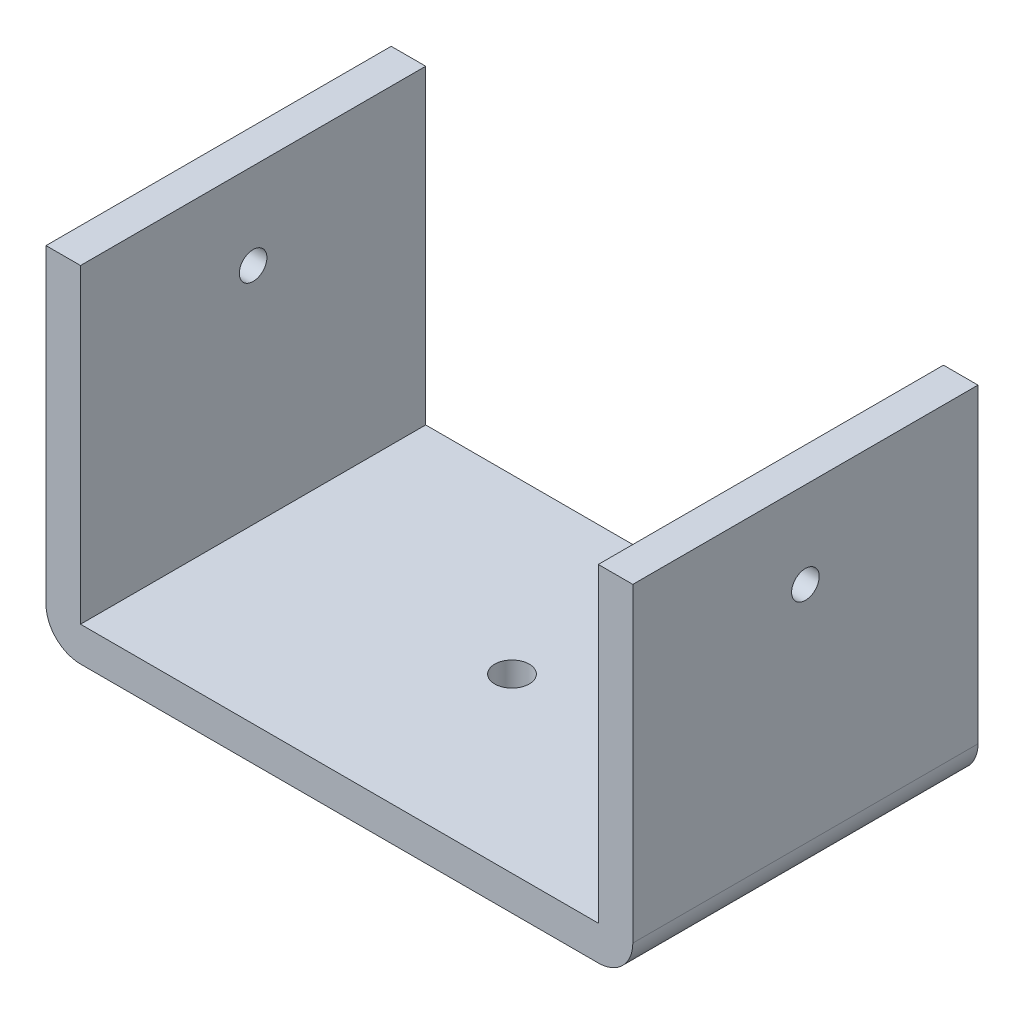
ISO-10303-21;
HEADER;
FILE_DESCRIPTION(('STEP AP214'),'2;1');
FILE_NAME('part.step','',(''),(''),'','','');
FILE_SCHEMA(('AUTOMOTIVE_DESIGN { 1 0 10303 214 1 1 1 1 }'));
ENDSEC;
DATA;
#1=APPLICATION_CONTEXT('core data for automotive mechanical design processes');
#2=APPLICATION_PROTOCOL_DEFINITION('international standard','automotive_design',2000,#1);
#3=PRODUCT_CONTEXT('',#1,'mechanical');
#4=PRODUCT('Part','Part','',(#3));
#5=PRODUCT_RELATED_PRODUCT_CATEGORY('part','',(#4));
#6=PRODUCT_DEFINITION_FORMATION('','',#4);
#7=PRODUCT_DEFINITION_CONTEXT('part definition',#1,'design');
#8=PRODUCT_DEFINITION('design','',#6,#7);
#9=PRODUCT_DEFINITION_SHAPE('','',#8);
#10=(LENGTH_UNIT() NAMED_UNIT(*) SI_UNIT(.MILLI.,.METRE.));
#11=(NAMED_UNIT(*) PLANE_ANGLE_UNIT() SI_UNIT($,.RADIAN.));
#12=(NAMED_UNIT(*) SI_UNIT($,.STERADIAN.) SOLID_ANGLE_UNIT());
#13=UNCERTAINTY_MEASURE_WITH_UNIT(LENGTH_MEASURE(1.E-05),#10,'distance_accuracy_value','');
#14=(GEOMETRIC_REPRESENTATION_CONTEXT(3) GLOBAL_UNCERTAINTY_ASSIGNED_CONTEXT((#13)) GLOBAL_UNIT_ASSIGNED_CONTEXT((#10,
#11,#12)) REPRESENTATION_CONTEXT('',''));
#15=CARTESIAN_POINT('',(0.,0.,0.));
#16=DIRECTION('',(0.,0.,1.));
#17=DIRECTION('',(1.,0.,0.));
#18=AXIS2_PLACEMENT_3D('',#15,#16,#17);
#19=CARTESIAN_POINT('',(0.,0.,100.));
#20=DIRECTION('',(0.,1.,0.));
#21=DIRECTION('',(0.,0.,1.));
#22=AXIS2_PLACEMENT_3D('',#19,#20,#21);
#23=PLANE('',#22);
#24=CARTESIAN_POINT('',(75.,0.,50.));
#25=DIRECTION('',(0.,1.,0.));
#26=DIRECTION('',(0.,0.,1.));
#27=AXIS2_PLACEMENT_3D('',#24,#25,#26);
#28=CIRCLE('',#27,5.00000000000001);
#29=CARTESIAN_POINT('',(75.,0.,55.));
#30=VERTEX_POINT('',#29);
#31=EDGE_CURVE('E339',#30,#30,#28,.T.);
#32=ORIENTED_EDGE('',*,*,#31,.F.);
#33=EDGE_LOOP('',(#32));
#34=FACE_BOUND('',#33,.T.);
#35=DIRECTION('',(1.,0.,0.));
#36=VECTOR('',#35,1.);
#37=CARTESIAN_POINT('',(0.,0.,0.));
#38=LINE('',#37,#36);
#39=CARTESIAN_POINT('',(0.,0.,0.));
#40=VERTEX_POINT('',#39);
#41=CARTESIAN_POINT('',(150.,0.,0.));
#42=VERTEX_POINT('',#41);
#43=EDGE_CURVE('E123',#40,#42,#38,.T.);
#44=ORIENTED_EDGE('',*,*,#43,.F.);
#45=DIRECTION('',(0.,0.,-1.));
#46=VECTOR('',#45,1.);
#47=CARTESIAN_POINT('',(0.,0.,100.));
#48=LINE('',#47,#46);
#49=CARTESIAN_POINT('',(0.,0.,100.));
#50=VERTEX_POINT('',#49);
#51=EDGE_CURVE('E118',#50,#40,#48,.T.);
#52=ORIENTED_EDGE('',*,*,#51,.F.);
#53=DIRECTION('',(1.,0.,0.));
#54=VECTOR('',#53,1.);
#55=CARTESIAN_POINT('',(0.,0.,100.));
#56=LINE('',#55,#54);
#57=CARTESIAN_POINT('',(150.,0.,100.));
#58=VERTEX_POINT('',#57);
#59=EDGE_CURVE('E120',#50,#58,#56,.T.);
#60=ORIENTED_EDGE('',*,*,#59,.T.);
#61=DIRECTION('',(0.,0.,-1.));
#62=VECTOR('',#61,1.);
#63=CARTESIAN_POINT('',(150.,0.,100.));
#64=LINE('',#63,#62);
#65=EDGE_CURVE('E158',#58,#42,#64,.T.);
#66=ORIENTED_EDGE('',*,*,#65,.T.);
#67=EDGE_LOOP('',(#44,#52,#60,#66));
#68=FACE_BOUND('',#67,.T.);
#69=ADVANCED_FACE('F39',(#34,#68),#23,.T.);
#70=CARTESIAN_POINT('',(0.,0.,100.));
#71=DIRECTION('',(1.,0.,0.));
#72=DIRECTION('',(0.,0.,-1.));
#73=AXIS2_PLACEMENT_3D('',#70,#71,#72);
#74=PLANE('',#73);
#75=CARTESIAN_POINT('',(0.,65.,50.));
#76=DIRECTION('',(1.,0.,0.));
#77=DIRECTION('',(0.,0.,-1.));
#78=AXIS2_PLACEMENT_3D('',#75,#76,#77);
#79=CIRCLE('',#78,4.00000000000001);
#80=CARTESIAN_POINT('',(0.,65.,46.));
#81=VERTEX_POINT('',#80);
#82=EDGE_CURVE('E328',#81,#81,#79,.T.);
#83=ORIENTED_EDGE('',*,*,#82,.F.);
#84=EDGE_LOOP('',(#83));
#85=FACE_BOUND('',#84,.T.);
#86=DIRECTION('',(0.,-1.,0.));
#87=VECTOR('',#86,1.);
#88=CARTESIAN_POINT('',(0.,0.,0.));
#89=LINE('',#88,#87);
#90=CARTESIAN_POINT('',(0.,90.,0.));
#91=VERTEX_POINT('',#90);
#92=EDGE_CURVE('E160',#91,#40,#89,.T.);
#93=ORIENTED_EDGE('',*,*,#92,.F.);
#94=DIRECTION('',(0.,0.,-1.));
#95=VECTOR('',#94,1.);
#96=CARTESIAN_POINT('',(0.,90.,100.));
#97=LINE('',#96,#95);
#98=CARTESIAN_POINT('',(0.,90.,100.));
#99=VERTEX_POINT('',#98);
#100=EDGE_CURVE('E129',#99,#91,#97,.T.);
#101=ORIENTED_EDGE('',*,*,#100,.F.);
#102=DIRECTION('',(0.,-1.,0.));
#103=VECTOR('',#102,1.);
#104=CARTESIAN_POINT('',(0.,0.,100.));
#105=LINE('',#104,#103);
#106=EDGE_CURVE('E135',#99,#50,#105,.T.);
#107=ORIENTED_EDGE('',*,*,#106,.T.);
#108=ORIENTED_EDGE('',*,*,#51,.T.);
#109=EDGE_LOOP('',(#93,#101,#107,#108));
#110=FACE_BOUND('',#109,.T.);
#111=ADVANCED_FACE('F141',(#85,#110),#74,.T.);
#112=CARTESIAN_POINT('',(0.,90.,100.));
#113=DIRECTION('',(0.,-1.,0.));
#114=DIRECTION('',(0.,0.,-1.));
#115=AXIS2_PLACEMENT_3D('',#112,#113,#114);
#116=PLANE('',#115);
#117=DIRECTION('',(-1.,0.,0.));
#118=VECTOR('',#117,1.);
#119=CARTESIAN_POINT('',(0.,90.,0.));
#120=LINE('',#119,#118);
#121=CARTESIAN_POINT('',(-10.,90.,0.));
#122=VERTEX_POINT('',#121);
#123=EDGE_CURVE('E163',#91,#122,#120,.T.);
#124=ORIENTED_EDGE('',*,*,#123,.T.);
#125=DIRECTION('',(0.,0.,-1.));
#126=VECTOR('',#125,1.);
#127=CARTESIAN_POINT('',(-10.,90.,100.));
#128=LINE('',#127,#126);
#129=CARTESIAN_POINT('',(-10.,90.,100.));
#130=VERTEX_POINT('',#129);
#131=EDGE_CURVE('E183',#130,#122,#128,.T.);
#132=ORIENTED_EDGE('',*,*,#131,.F.);
#133=DIRECTION('',(-1.,0.,0.));
#134=VECTOR('',#133,1.);
#135=CARTESIAN_POINT('',(0.,90.,100.));
#136=LINE('',#135,#134);
#137=EDGE_CURVE('E143',#99,#130,#136,.T.);
#138=ORIENTED_EDGE('',*,*,#137,.F.);
#139=ORIENTED_EDGE('',*,*,#100,.T.);
#140=EDGE_LOOP('',(#124,#132,#138,#139));
#141=FACE_BOUND('',#140,.T.);
#142=ADVANCED_FACE('F219',(#141),#116,.F.);
#143=CARTESIAN_POINT('',(-10.,0.,100.));
#144=DIRECTION('',(-1.,0.,0.));
#145=DIRECTION('',(0.,-1.,0.));
#146=AXIS2_PLACEMENT_3D('',#143,#144,#145);
#147=PLANE('',#146);
#148=CARTESIAN_POINT('',(-10.,65.,50.));
#149=DIRECTION('',(-1.,0.,0.));
#150=DIRECTION('',(0.,-1.,0.));
#151=AXIS2_PLACEMENT_3D('',#148,#149,#150);
#152=CIRCLE('',#151,4.00000000000001);
#153=CARTESIAN_POINT('',(-10.,61.,50.));
#154=VERTEX_POINT('',#153);
#155=EDGE_CURVE('E331',#154,#154,#152,.T.);
#156=ORIENTED_EDGE('',*,*,#155,.F.);
#157=EDGE_LOOP('',(#156));
#158=FACE_BOUND('',#157,.T.);
#159=DIRECTION('',(0.,1.,0.));
#160=VECTOR('',#159,1.);
#161=CARTESIAN_POINT('',(-10.,0.,0.));
#162=LINE('',#161,#160);
#163=CARTESIAN_POINT('',(-10.,0.,0.));
#164=VERTEX_POINT('',#163);
#165=EDGE_CURVE('E166',#164,#122,#162,.T.);
#166=ORIENTED_EDGE('',*,*,#165,.F.);
#167=DIRECTION('',(0.,0.,-1.));
#168=VECTOR('',#167,1.);
#169=CARTESIAN_POINT('',(-10.,0.,100.));
#170=LINE('',#169,#168);
#171=CARTESIAN_POINT('',(-10.,0.,100.));
#172=VERTEX_POINT('',#171);
#173=EDGE_CURVE('E11',#164,#172,#170,.F.);
#174=ORIENTED_EDGE('',*,*,#173,.T.);
#175=DIRECTION('',(0.,1.,0.));
#176=VECTOR('',#175,1.);
#177=CARTESIAN_POINT('',(-10.,0.,100.));
#178=LINE('',#177,#176);
#179=EDGE_CURVE('E145',#172,#130,#178,.T.);
#180=ORIENTED_EDGE('',*,*,#179,.T.);
#181=ORIENTED_EDGE('',*,*,#131,.T.);
#182=EDGE_LOOP('',(#166,#174,#180,#181));
#183=FACE_BOUND('',#182,.T.);
#184=ADVANCED_FACE('F216',(#158,#183),#147,.T.);
#185=CARTESIAN_POINT('',(0.,-10.,100.));
#186=DIRECTION('',(0.,1.,0.));
#187=DIRECTION('',(0.,0.,1.));
#188=AXIS2_PLACEMENT_3D('',#185,#186,#187);
#189=PLANE('',#188);
#190=CARTESIAN_POINT('',(75.,-10.,50.));
#191=DIRECTION('',(0.,1.,0.));
#192=DIRECTION('',(0.,0.,1.));
#193=AXIS2_PLACEMENT_3D('',#190,#191,#192);
#194=CIRCLE('',#193,5.00000000000001);
#195=CARTESIAN_POINT('',(75.,-10.,55.));
#196=VERTEX_POINT('',#195);
#197=EDGE_CURVE('E161',#196,#196,#194,.T.);
#198=ORIENTED_EDGE('',*,*,#197,.T.);
#199=EDGE_LOOP('',(#198));
#200=FACE_BOUND('',#199,.T.);
#201=DIRECTION('',(1.,0.,0.));
#202=VECTOR('',#201,1.);
#203=CARTESIAN_POINT('',(0.,-10.,0.));
#204=LINE('',#203,#202);
#205=CARTESIAN_POINT('',(0.,-10.,0.));
#206=VERTEX_POINT('',#205);
#207=CARTESIAN_POINT('',(150.,-10.,0.));
#208=VERTEX_POINT('',#207);
#209=EDGE_CURVE('E168',#206,#208,#204,.T.);
#210=ORIENTED_EDGE('',*,*,#209,.T.);
#211=DIRECTION('',(0.,0.,-1.));
#212=VECTOR('',#211,1.);
#213=CARTESIAN_POINT('',(150.,-10.,100.));
#214=LINE('',#213,#212);
#215=CARTESIAN_POINT('',(150.,-10.,100.));
#216=VERTEX_POINT('',#215);
#217=EDGE_CURVE('E61',#208,#216,#214,.F.);
#218=ORIENTED_EDGE('',*,*,#217,.T.);
#219=DIRECTION('',(1.,0.,0.));
#220=VECTOR('',#219,1.);
#221=CARTESIAN_POINT('',(0.,-10.,100.));
#222=LINE('',#221,#220);
#223=CARTESIAN_POINT('',(0.,-10.,100.));
#224=VERTEX_POINT('',#223);
#225=EDGE_CURVE('E150',#224,#216,#222,.T.);
#226=ORIENTED_EDGE('',*,*,#225,.F.);
#227=DIRECTION('',(0.,0.,-1.));
#228=VECTOR('',#227,1.);
#229=CARTESIAN_POINT('',(0.,-10.,0.));
#230=LINE('',#229,#228);
#231=EDGE_CURVE('E193',#224,#206,#230,.T.);
#232=ORIENTED_EDGE('',*,*,#231,.T.);
#233=EDGE_LOOP('',(#210,#218,#226,#232));
#234=FACE_BOUND('',#233,.T.);
#235=ADVANCED_FACE('F211',(#200,#234),#189,.F.);
#236=CARTESIAN_POINT('',(160.,0.,100.));
#237=DIRECTION('',(-1.,0.,0.));
#238=DIRECTION('',(0.,0.,1.));
#239=AXIS2_PLACEMENT_3D('',#236,#237,#238);
#240=PLANE('',#239);
#241=CARTESIAN_POINT('',(160.,65.,50.));
#242=DIRECTION('',(-1.,0.,0.));
#243=DIRECTION('',(0.,0.,1.));
#244=AXIS2_PLACEMENT_3D('',#241,#242,#243);
#245=CIRCLE('',#244,4.00000000000001);
#246=CARTESIAN_POINT('',(160.,65.,54.));
#247=VERTEX_POINT('',#246);
#248=EDGE_CURVE('E334',#247,#247,#245,.T.);
#249=ORIENTED_EDGE('',*,*,#248,.T.);
#250=EDGE_LOOP('',(#249));
#251=FACE_BOUND('',#250,.T.);
#252=DIRECTION('',(0.,1.,0.));
#253=VECTOR('',#252,1.);
#254=CARTESIAN_POINT('',(160.,0.,100.));
#255=LINE('',#254,#253);
#256=CARTESIAN_POINT('',(160.,0.,100.));
#257=VERTEX_POINT('',#256);
#258=CARTESIAN_POINT('',(160.,90.,100.));
#259=VERTEX_POINT('',#258);
#260=EDGE_CURVE('E152',#257,#259,#255,.T.);
#261=ORIENTED_EDGE('',*,*,#260,.F.);
#262=DIRECTION('',(0.,0.,-1.));
#263=VECTOR('',#262,1.);
#264=CARTESIAN_POINT('',(160.,0.,100.));
#265=LINE('',#264,#263);
#266=CARTESIAN_POINT('',(160.,0.,0.));
#267=VERTEX_POINT('',#266);
#268=EDGE_CURVE('E128',#257,#267,#265,.T.);
#269=ORIENTED_EDGE('',*,*,#268,.T.);
#270=DIRECTION('',(0.,1.,0.));
#271=VECTOR('',#270,1.);
#272=CARTESIAN_POINT('',(160.,0.,0.));
#273=LINE('',#272,#271);
#274=CARTESIAN_POINT('',(160.,90.,0.));
#275=VERTEX_POINT('',#274);
#276=EDGE_CURVE('E170',#267,#275,#273,.T.);
#277=ORIENTED_EDGE('',*,*,#276,.T.);
#278=DIRECTION('',(0.,0.,-1.));
#279=VECTOR('',#278,1.);
#280=CARTESIAN_POINT('',(160.,90.,100.));
#281=LINE('',#280,#279);
#282=EDGE_CURVE('E180',#259,#275,#281,.T.);
#283=ORIENTED_EDGE('',*,*,#282,.F.);
#284=EDGE_LOOP('',(#261,#269,#277,#283));
#285=FACE_BOUND('',#284,.T.);
#286=ADVANCED_FACE('F205',(#251,#285),#240,.F.);
#287=CARTESIAN_POINT('',(0.,90.,100.));
#288=DIRECTION('',(0.,1.,0.));
#289=DIRECTION('',(0.,0.,1.));
#290=AXIS2_PLACEMENT_3D('',#287,#288,#289);
#291=PLANE('',#290);
#292=DIRECTION('',(1.,0.,0.));
#293=VECTOR('',#292,1.);
#294=CARTESIAN_POINT('',(0.,90.,0.));
#295=LINE('',#294,#293);
#296=CARTESIAN_POINT('',(150.,90.,0.));
#297=VERTEX_POINT('',#296);
#298=EDGE_CURVE('E172',#297,#275,#295,.T.);
#299=ORIENTED_EDGE('',*,*,#298,.F.);
#300=DIRECTION('',(0.,0.,-1.));
#301=VECTOR('',#300,1.);
#302=CARTESIAN_POINT('',(150.,90.,100.));
#303=LINE('',#302,#301);
#304=CARTESIAN_POINT('',(150.,90.,100.));
#305=VERTEX_POINT('',#304);
#306=EDGE_CURVE('E178',#305,#297,#303,.T.);
#307=ORIENTED_EDGE('',*,*,#306,.F.);
#308=DIRECTION('',(1.,0.,0.));
#309=VECTOR('',#308,1.);
#310=CARTESIAN_POINT('',(0.,90.,100.));
#311=LINE('',#310,#309);
#312=EDGE_CURVE('E154',#305,#259,#311,.T.);
#313=ORIENTED_EDGE('',*,*,#312,.T.);
#314=ORIENTED_EDGE('',*,*,#282,.T.);
#315=EDGE_LOOP('',(#299,#307,#313,#314));
#316=FACE_BOUND('',#315,.T.);
#317=ADVANCED_FACE('F225',(#316),#291,.T.);
#318=CARTESIAN_POINT('',(150.,0.,100.));
#319=DIRECTION('',(-1.,0.,0.));
#320=DIRECTION('',(0.,0.,1.));
#321=AXIS2_PLACEMENT_3D('',#318,#319,#320);
#322=PLANE('',#321);
#323=CARTESIAN_POINT('',(150.,65.,50.));
#324=DIRECTION('',(-1.,0.,0.));
#325=DIRECTION('',(0.,0.,1.));
#326=AXIS2_PLACEMENT_3D('',#323,#324,#325);
#327=CIRCLE('',#326,4.00000000000001);
#328=CARTESIAN_POINT('',(150.,65.,54.));
#329=VERTEX_POINT('',#328);
#330=EDGE_CURVE('E43',#329,#329,#327,.T.);
#331=ORIENTED_EDGE('',*,*,#330,.F.);
#332=EDGE_LOOP('',(#331));
#333=FACE_BOUND('',#332,.T.);
#334=DIRECTION('',(0.,1.,0.));
#335=VECTOR('',#334,1.);
#336=CARTESIAN_POINT('',(150.,0.,0.));
#337=LINE('',#336,#335);
#338=EDGE_CURVE('E139',#42,#297,#337,.T.);
#339=ORIENTED_EDGE('',*,*,#338,.F.);
#340=ORIENTED_EDGE('',*,*,#65,.F.);
#341=DIRECTION('',(0.,1.,0.));
#342=VECTOR('',#341,1.);
#343=CARTESIAN_POINT('',(150.,0.,100.));
#344=LINE('',#343,#342);
#345=EDGE_CURVE('E138',#58,#305,#344,.T.);
#346=ORIENTED_EDGE('',*,*,#345,.T.);
#347=ORIENTED_EDGE('',*,*,#306,.T.);
#348=EDGE_LOOP('',(#339,#340,#346,#347));
#349=FACE_BOUND('',#348,.T.);
#350=ADVANCED_FACE('F222',(#333,#349),#322,.T.);
#351=CARTESIAN_POINT('',(0.,0.,100.));
#352=DIRECTION('',(0.,0.,1.));
#353=DIRECTION('',(1.,0.,0.));
#354=AXIS2_PLACEMENT_3D('',#351,#352,#353);
#355=PLANE('',#354);
#356=ORIENTED_EDGE('',*,*,#225,.T.);
#357=CARTESIAN_POINT('',(150.,0.,100.));
#358=DIRECTION('',(0.,0.,1.));
#359=DIRECTION('',(1.,0.,0.));
#360=AXIS2_PLACEMENT_3D('',#357,#358,#359);
#361=CIRCLE('',#360,10.);
#362=EDGE_CURVE('E48',#216,#257,#361,.T.);
#363=ORIENTED_EDGE('',*,*,#362,.T.);
#364=ORIENTED_EDGE('',*,*,#260,.T.);
#365=ORIENTED_EDGE('',*,*,#312,.F.);
#366=ORIENTED_EDGE('',*,*,#345,.F.);
#367=ORIENTED_EDGE('',*,*,#59,.F.);
#368=ORIENTED_EDGE('',*,*,#106,.F.);
#369=ORIENTED_EDGE('',*,*,#137,.T.);
#370=ORIENTED_EDGE('',*,*,#179,.F.);
#371=CARTESIAN_POINT('',(0.,0.,100.));
#372=DIRECTION('',(0.,0.,1.));
#373=DIRECTION('',(1.,0.,0.));
#374=AXIS2_PLACEMENT_3D('',#371,#372,#373);
#375=CIRCLE('',#374,10.);
#376=EDGE_CURVE('E197',#172,#224,#375,.T.);
#377=ORIENTED_EDGE('',*,*,#376,.T.);
#378=EDGE_LOOP('',(#356,#363,#364,#365,#366,#367,#368,#369,#370,#377));
#379=FACE_BOUND('',#378,.T.);
#380=ADVANCED_FACE('F133',(#379),#355,.T.);
#381=CARTESIAN_POINT('',(0.,0.,0.));
#382=DIRECTION('',(0.,0.,1.));
#383=DIRECTION('',(1.,0.,0.));
#384=AXIS2_PLACEMENT_3D('',#381,#382,#383);
#385=PLANE('',#384);
#386=ORIENTED_EDGE('',*,*,#276,.F.);
#387=CARTESIAN_POINT('',(150.,0.,0.));
#388=DIRECTION('',(0.,0.,1.));
#389=DIRECTION('',(1.,0.,0.));
#390=AXIS2_PLACEMENT_3D('',#387,#388,#389);
#391=CIRCLE('',#390,10.);
#392=EDGE_CURVE('E191',#267,#208,#391,.F.);
#393=ORIENTED_EDGE('',*,*,#392,.T.);
#394=ORIENTED_EDGE('',*,*,#209,.F.);
#395=CARTESIAN_POINT('',(0.,0.,0.));
#396=DIRECTION('',(0.,0.,1.));
#397=DIRECTION('',(1.,0.,0.));
#398=AXIS2_PLACEMENT_3D('',#395,#396,#397);
#399=CIRCLE('',#398,10.);
#400=EDGE_CURVE('E189',#206,#164,#399,.F.);
#401=ORIENTED_EDGE('',*,*,#400,.T.);
#402=ORIENTED_EDGE('',*,*,#165,.T.);
#403=ORIENTED_EDGE('',*,*,#123,.F.);
#404=ORIENTED_EDGE('',*,*,#92,.T.);
#405=ORIENTED_EDGE('',*,*,#43,.T.);
#406=ORIENTED_EDGE('',*,*,#338,.T.);
#407=ORIENTED_EDGE('',*,*,#298,.T.);
#408=EDGE_LOOP('',(#386,#393,#394,#401,#402,#403,#404,#405,#406,#407));
#409=FACE_BOUND('',#408,.T.);
#410=ADVANCED_FACE('F210',(#409),#385,.F.);
#411=CARTESIAN_POINT('',(75.,-10.,50.));
#412=DIRECTION('',(0.,1.,0.));
#413=DIRECTION('',(0.,0.,1.));
#414=AXIS2_PLACEMENT_3D('',#411,#412,#413);
#415=CYLINDRICAL_SURFACE('',#414,5.00000000000001);
#416=ORIENTED_EDGE('',*,*,#197,.F.);
#417=EDGE_LOOP('',(#416));
#418=FACE_BOUND('',#417,.T.);
#419=ORIENTED_EDGE('',*,*,#31,.T.);
#420=EDGE_LOOP('',(#419));
#421=FACE_BOUND('',#420,.T.);
#422=ADVANCED_FACE('F250',(#418,#421),#415,.F.);
#423=CARTESIAN_POINT('',(150.,0.,100.));
#424=DIRECTION('',(0.,0.,-1.));
#425=DIRECTION('',(-1.,0.,0.));
#426=AXIS2_PLACEMENT_3D('',#423,#424,#425);
#427=CYLINDRICAL_SURFACE('',#426,10.);
#428=ORIENTED_EDGE('',*,*,#362,.F.);
#429=ORIENTED_EDGE('',*,*,#217,.F.);
#430=ORIENTED_EDGE('',*,*,#392,.F.);
#431=ORIENTED_EDGE('',*,*,#268,.F.);
#432=EDGE_LOOP('',(#428,#429,#430,#431));
#433=FACE_BOUND('',#432,.T.);
#434=ADVANCED_FACE('F207',(#433),#427,.T.);
#435=CARTESIAN_POINT('',(0.,0.,100.));
#436=DIRECTION('',(0.,0.,1.));
#437=DIRECTION('',(1.,0.,0.));
#438=AXIS2_PLACEMENT_3D('',#435,#436,#437);
#439=CYLINDRICAL_SURFACE('',#438,10.);
#440=ORIENTED_EDGE('',*,*,#376,.F.);
#441=ORIENTED_EDGE('',*,*,#173,.F.);
#442=ORIENTED_EDGE('',*,*,#400,.F.);
#443=ORIENTED_EDGE('',*,*,#231,.F.);
#444=EDGE_LOOP('',(#440,#441,#442,#443));
#445=FACE_BOUND('',#444,.T.);
#446=ADVANCED_FACE('F41',(#445),#439,.T.);
#447=CARTESIAN_POINT('',(182.,65.,50.));
#448=DIRECTION('',(-1.,0.,0.));
#449=DIRECTION('',(0.,-1.,0.));
#450=AXIS2_PLACEMENT_3D('',#447,#448,#449);
#451=CYLINDRICAL_SURFACE('',#450,4.00000000000001);
#452=ORIENTED_EDGE('',*,*,#330,.T.);
#453=EDGE_LOOP('',(#452));
#454=FACE_BOUND('',#453,.T.);
#455=ORIENTED_EDGE('',*,*,#248,.F.);
#456=EDGE_LOOP('',(#455));
#457=FACE_BOUND('',#456,.T.);
#458=ADVANCED_FACE('F255',(#454,#457),#451,.F.);
#459=ORIENTED_EDGE('',*,*,#82,.T.);
#460=EDGE_LOOP('',(#459));
#461=FACE_BOUND('',#460,.T.);
#462=ORIENTED_EDGE('',*,*,#155,.T.);
#463=EDGE_LOOP('',(#462));
#464=FACE_BOUND('',#463,.T.);
#465=ADVANCED_FACE('F313',(#461,#464),#451,.F.);
#466=CLOSED_SHELL('',(#69,#111,#142,#184,#235,#286,#317,#350,#380,#410,#422,#434,#446,#458,#465));
#467=MANIFOLD_SOLID_BREP('B2',#466);
#468=ADVANCED_BREP_SHAPE_REPRESENTATION('',(#18,#467),#14);
#469=SHAPE_DEFINITION_REPRESENTATION(#9,#468);
ENDSEC;
END-ISO-10303-21;
